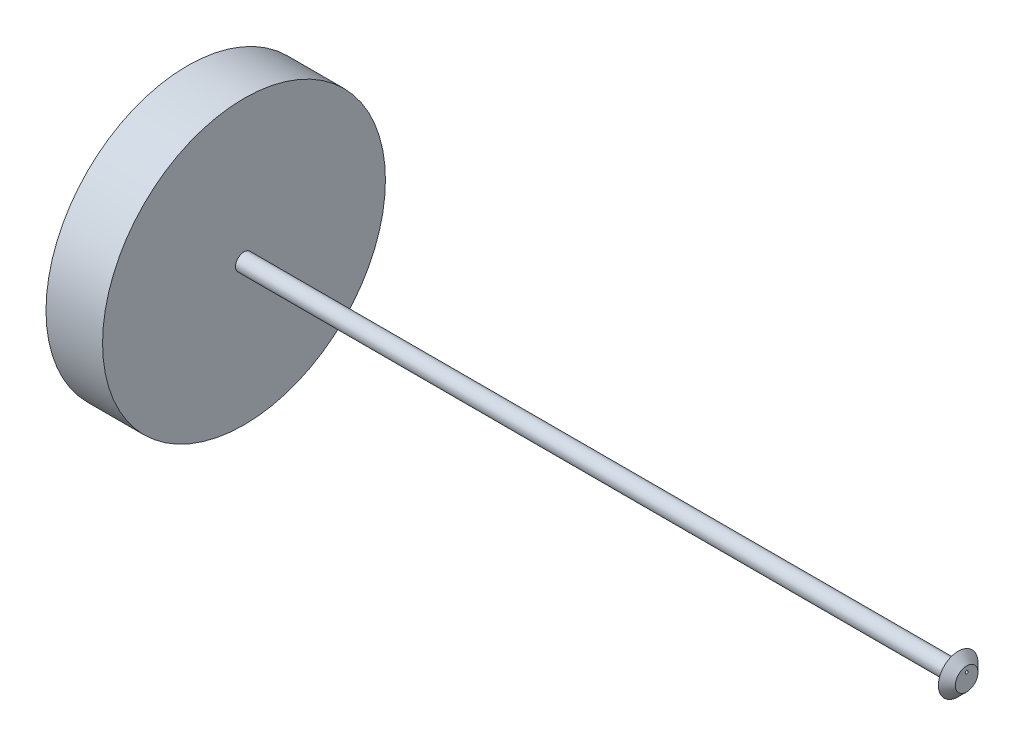
ISO-10303-21;
HEADER;
FILE_DESCRIPTION(('STEP AP214'),'2;1');
FILE_NAME('part.step','',(''),(''),'','','');
FILE_SCHEMA(('AUTOMOTIVE_DESIGN { 1 0 10303 214 1 1 1 1 }'));
ENDSEC;
DATA;
#1=APPLICATION_CONTEXT('core data for automotive mechanical design processes');
#2=APPLICATION_PROTOCOL_DEFINITION('international standard','automotive_design',2000,#1);
#3=PRODUCT_CONTEXT('',#1,'mechanical');
#4=PRODUCT('Part','Part','',(#3));
#5=PRODUCT_RELATED_PRODUCT_CATEGORY('part','',(#4));
#6=PRODUCT_DEFINITION_FORMATION('','',#4);
#7=PRODUCT_DEFINITION_CONTEXT('part definition',#1,'design');
#8=PRODUCT_DEFINITION('design','',#6,#7);
#9=PRODUCT_DEFINITION_SHAPE('','',#8);
#10=(LENGTH_UNIT() NAMED_UNIT(*) SI_UNIT(.MILLI.,.METRE.));
#11=(NAMED_UNIT(*) PLANE_ANGLE_UNIT() SI_UNIT($,.RADIAN.));
#12=(NAMED_UNIT(*) SI_UNIT($,.STERADIAN.) SOLID_ANGLE_UNIT());
#13=UNCERTAINTY_MEASURE_WITH_UNIT(LENGTH_MEASURE(1.E-05),#10,'distance_accuracy_value','');
#14=(GEOMETRIC_REPRESENTATION_CONTEXT(3) GLOBAL_UNCERTAINTY_ASSIGNED_CONTEXT((#13)) GLOBAL_UNIT_ASSIGNED_CONTEXT((#10,
#11,#12)) REPRESENTATION_CONTEXT('',''));
#15=CARTESIAN_POINT('',(0.,0.,0.));
#16=DIRECTION('',(0.,0.,1.));
#17=DIRECTION('',(1.,0.,0.));
#18=AXIS2_PLACEMENT_3D('',#15,#16,#17);
#19=CARTESIAN_POINT('',(26.2499999999999,0.,-128.5));
#20=DIRECTION('',(-1.,0.,0.));
#21=DIRECTION('',(0.,0.,1.));
#22=AXIS2_PLACEMENT_3D('',#19,#20,#21);
#23=PLANE('',#22);
#24=CARTESIAN_POINT('',(26.2499999999999,0.,-125.));
#25=DIRECTION('',(1.,0.,0.));
#26=DIRECTION('',(0.,0.,-1.));
#27=AXIS2_PLACEMENT_3D('',#24,#25,#26);
#28=CIRCLE('',#27,1.5);
#29=CARTESIAN_POINT('',(26.2499999999999,0.,-126.5));
#30=VERTEX_POINT('',#29);
#31=EDGE_CURVE('E68',#30,#30,#28,.T.);
#32=ORIENTED_EDGE('',*,*,#31,.T.);
#33=EDGE_LOOP('',(#32));
#34=FACE_BOUND('',#33,.T.);
#35=CARTESIAN_POINT('',(26.2499999999999,0.,-125.));
#36=DIRECTION('',(1.,0.,0.));
#37=DIRECTION('',(0.,0.,-1.));
#38=AXIS2_PLACEMENT_3D('',#35,#36,#37);
#39=CIRCLE('',#38,3.50000000000003);
#40=CARTESIAN_POINT('',(26.2499999999999,0.,-128.5));
#41=VERTEX_POINT('',#40);
#42=EDGE_CURVE('E54',#41,#41,#39,.T.);
#43=ORIENTED_EDGE('',*,*,#42,.F.);
#44=EDGE_LOOP('',(#43));
#45=FACE_BOUND('',#44,.T.);
#46=ADVANCED_FACE('F44',(#34,#45),#23,.T.);
#47=CARTESIAN_POINT('',(26.7499999999999,0.,0.));
#48=DIRECTION('',(1.,0.,0.));
#49=DIRECTION('',(0.,0.,-1.));
#50=AXIS2_PLACEMENT_3D('',#47,#48,#49);
#51=PLANE('',#50);
#52=CARTESIAN_POINT('',(26.7499999999999,1.00000000000003,-125.));
#53=DIRECTION('',(1.,0.,0.));
#54=DIRECTION('',(0.,0.,-1.));
#55=AXIS2_PLACEMENT_3D('',#52,#53,#54);
#56=CIRCLE('',#55,0.250000000000013);
#57=CARTESIAN_POINT('',(26.7499999999999,1.00000000000003,-125.25));
#58=VERTEX_POINT('',#57);
#59=EDGE_CURVE('E47',#58,#58,#56,.T.);
#60=ORIENTED_EDGE('',*,*,#59,.T.);
#61=EDGE_LOOP('',(#60));
#62=FACE_BOUND('',#61,.T.);
#63=ADVANCED_FACE('F94',(#62),#51,.T.);
#64=CARTESIAN_POINT('',(26.7499999999999,1.00000000000003,-125.));
#65=DIRECTION('',(1.,0.,0.));
#66=DIRECTION('',(0.,0.,-1.));
#67=AXIS2_PLACEMENT_3D('',#64,#65,#66);
#68=CYLINDRICAL_SURFACE('',#67,0.250000000000013);
#69=ORIENTED_EDGE('',*,*,#59,.F.);
#70=EDGE_LOOP('',(#69));
#71=FACE_BOUND('',#70,.T.);
#72=CARTESIAN_POINT('',(27.7499999999999,1.00000000000003,-125.));
#73=DIRECTION('',(1.,0.,0.));
#74=DIRECTION('',(0.,0.,-1.));
#75=AXIS2_PLACEMENT_3D('',#72,#73,#74);
#76=CIRCLE('',#75,0.250000000000013);
#77=CARTESIAN_POINT('',(27.7499999999999,1.00000000000003,-125.25));
#78=VERTEX_POINT('',#77);
#79=EDGE_CURVE('E11',#78,#78,#76,.T.);
#80=ORIENTED_EDGE('',*,*,#79,.T.);
#81=EDGE_LOOP('',(#80));
#82=FACE_BOUND('',#81,.T.);
#83=ADVANCED_FACE('F96',(#71,#82),#68,.F.);
#84=CARTESIAN_POINT('',(27.7499999999999,0.,-125.));
#85=DIRECTION('',(1.,0.,0.));
#86=DIRECTION('',(0.,0.,-1.));
#87=AXIS2_PLACEMENT_3D('',#84,#85,#86);
#88=PLANE('',#87);
#89=ORIENTED_EDGE('',*,*,#79,.F.);
#90=EDGE_LOOP('',(#89));
#91=FACE_BOUND('',#90,.T.);
#92=CARTESIAN_POINT('',(27.7499999999999,0.,-125.));
#93=DIRECTION('',(1.,0.,0.));
#94=DIRECTION('',(0.,0.,-1.));
#95=AXIS2_PLACEMENT_3D('',#92,#93,#94);
#96=CIRCLE('',#95,2.00000000000006);
#97=CARTESIAN_POINT('',(27.7499999999999,0.,-127.));
#98=VERTEX_POINT('',#97);
#99=EDGE_CURVE('E58',#98,#98,#96,.T.);
#100=ORIENTED_EDGE('',*,*,#99,.T.);
#101=EDGE_LOOP('',(#100));
#102=FACE_BOUND('',#101,.T.);
#103=ADVANCED_FACE('F89',(#91,#102),#88,.T.);
#104=CARTESIAN_POINT('',(26.2499999999999,0.,-125.));
#105=DIRECTION('',(-1.,0.,0.));
#106=DIRECTION('',(0.,0.,1.));
#107=AXIS2_PLACEMENT_3D('',#104,#105,#106);
#108=CONICAL_SURFACE('',#107,3.50000000000003,0.78539816339744);
#109=ORIENTED_EDGE('',*,*,#99,.F.);
#110=EDGE_LOOP('',(#109));
#111=FACE_BOUND('',#110,.T.);
#112=ORIENTED_EDGE('',*,*,#42,.T.);
#113=EDGE_LOOP('',(#112));
#114=FACE_BOUND('',#113,.T.);
#115=ADVANCED_FACE('F79',(#111,#114),#108,.T.);
#116=CARTESIAN_POINT('',(-100.,0.,-125.));
#117=DIRECTION('',(1.,0.,0.));
#118=DIRECTION('',(0.,0.,-1.));
#119=AXIS2_PLACEMENT_3D('',#116,#117,#118);
#120=CYLINDRICAL_SURFACE('',#119,1.5);
#121=CARTESIAN_POINT('',(-100.,0.,-125.));
#122=DIRECTION('',(-1.,0.,0.));
#123=DIRECTION('',(0.,0.,1.));
#124=AXIS2_PLACEMENT_3D('',#121,#122,#123);
#125=CIRCLE('',#124,1.5);
#126=CARTESIAN_POINT('',(-100.,0.,-123.5));
#127=VERTEX_POINT('',#126);
#128=EDGE_CURVE('E61',#127,#127,#125,.T.);
#129=ORIENTED_EDGE('',*,*,#128,.F.);
#130=EDGE_LOOP('',(#129));
#131=FACE_BOUND('',#130,.T.);
#132=ORIENTED_EDGE('',*,*,#31,.F.);
#133=EDGE_LOOP('',(#132));
#134=FACE_BOUND('',#133,.T.);
#135=ADVANCED_FACE('F76',(#131,#134),#120,.T.);
#136=CARTESIAN_POINT('',(-110.,0.,-125.000000000001));
#137=DIRECTION('',(1.,0.,0.));
#138=DIRECTION('',(0.,0.,-1.));
#139=AXIS2_PLACEMENT_3D('',#136,#137,#138);
#140=CYLINDRICAL_SURFACE('',#139,25.);
#141=CARTESIAN_POINT('',(-110.,0.,-125.000000000001));
#142=DIRECTION('',(-1.,0.,0.));
#143=DIRECTION('',(0.,0.,1.));
#144=AXIS2_PLACEMENT_3D('',#141,#142,#143);
#145=CIRCLE('',#144,25.);
#146=CARTESIAN_POINT('',(-110.,0.,-100.000000000001));
#147=VERTEX_POINT('',#146);
#148=EDGE_CURVE('E64',#147,#147,#145,.T.);
#149=ORIENTED_EDGE('',*,*,#148,.F.);
#150=EDGE_LOOP('',(#149));
#151=FACE_BOUND('',#150,.T.);
#152=CARTESIAN_POINT('',(-100.,0.,-125.000000000001));
#153=DIRECTION('',(-1.,0.,0.));
#154=DIRECTION('',(0.,0.,1.));
#155=AXIS2_PLACEMENT_3D('',#152,#153,#154);
#156=CIRCLE('',#155,25.);
#157=CARTESIAN_POINT('',(-100.,0.,-100.000000000001));
#158=VERTEX_POINT('',#157);
#159=EDGE_CURVE('E65',#158,#158,#156,.T.);
#160=ORIENTED_EDGE('',*,*,#159,.T.);
#161=EDGE_LOOP('',(#160));
#162=FACE_BOUND('',#161,.T.);
#163=ADVANCED_FACE('F78',(#151,#162),#140,.T.);
#164=CARTESIAN_POINT('',(-110.,0.,-125.000000000001));
#165=DIRECTION('',(-1.,0.,0.));
#166=DIRECTION('',(0.,0.,1.));
#167=AXIS2_PLACEMENT_3D('',#164,#165,#166);
#168=PLANE('',#167);
#169=ORIENTED_EDGE('',*,*,#148,.T.);
#170=EDGE_LOOP('',(#169));
#171=FACE_BOUND('',#170,.T.);
#172=ADVANCED_FACE('F85',(#171),#168,.T.);
#173=CARTESIAN_POINT('',(-100.,0.,-125.000000000001));
#174=DIRECTION('',(-1.,0.,0.));
#175=DIRECTION('',(0.,0.,1.));
#176=AXIS2_PLACEMENT_3D('',#173,#174,#175);
#177=PLANE('',#176);
#178=ORIENTED_EDGE('',*,*,#128,.T.);
#179=EDGE_LOOP('',(#178));
#180=FACE_BOUND('',#179,.T.);
#181=ORIENTED_EDGE('',*,*,#159,.F.);
#182=EDGE_LOOP('',(#181));
#183=FACE_BOUND('',#182,.T.);
#184=ADVANCED_FACE('F104',(#180,#183),#177,.F.);
#185=CLOSED_SHELL('',(#46,#63,#83,#103,#115,#135,#163,#172,#184));
#186=MANIFOLD_SOLID_BREP('B2',#185);
#187=ADVANCED_BREP_SHAPE_REPRESENTATION('',(#18,#186),#14);
#188=SHAPE_DEFINITION_REPRESENTATION(#9,#187);
ENDSEC;
END-ISO-10303-21;
